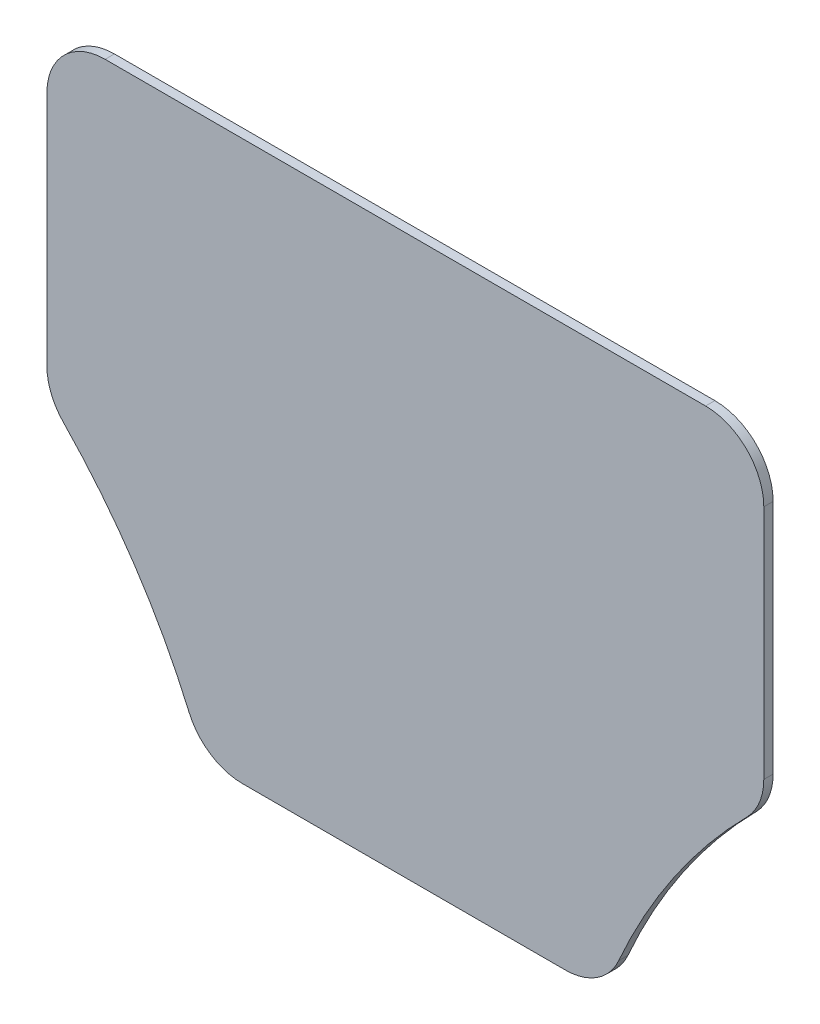
ISO-10303-21;
HEADER;
FILE_DESCRIPTION(('STEP AP214'),'2;1');
FILE_NAME('part.step','',(''),(''),'','','');
FILE_SCHEMA(('AUTOMOTIVE_DESIGN { 1 0 10303 214 1 1 1 1 }'));
ENDSEC;
DATA;
#1=APPLICATION_CONTEXT('core data for automotive mechanical design processes');
#2=APPLICATION_PROTOCOL_DEFINITION('international standard','automotive_design',2000,#1);
#3=PRODUCT_CONTEXT('',#1,'mechanical');
#4=PRODUCT('Part','Part','',(#3));
#5=PRODUCT_RELATED_PRODUCT_CATEGORY('part','',(#4));
#6=PRODUCT_DEFINITION_FORMATION('','',#4);
#7=PRODUCT_DEFINITION_CONTEXT('part definition',#1,'design');
#8=PRODUCT_DEFINITION('design','',#6,#7);
#9=PRODUCT_DEFINITION_SHAPE('','',#8);
#10=(LENGTH_UNIT() NAMED_UNIT(*) SI_UNIT(.MILLI.,.METRE.));
#11=(NAMED_UNIT(*) PLANE_ANGLE_UNIT() SI_UNIT($,.RADIAN.));
#12=(NAMED_UNIT(*) SI_UNIT($,.STERADIAN.) SOLID_ANGLE_UNIT());
#13=UNCERTAINTY_MEASURE_WITH_UNIT(LENGTH_MEASURE(1.E-05),#10,'distance_accuracy_value','');
#14=(GEOMETRIC_REPRESENTATION_CONTEXT(3) GLOBAL_UNCERTAINTY_ASSIGNED_CONTEXT((#13)) GLOBAL_UNIT_ASSIGNED_CONTEXT((#10,
#11,#12)) REPRESENTATION_CONTEXT('',''));
#15=CARTESIAN_POINT('',(0.,0.,0.));
#16=DIRECTION('',(0.,0.,1.));
#17=DIRECTION('',(1.,0.,0.));
#18=AXIS2_PLACEMENT_3D('',#15,#16,#17);
#19=CARTESIAN_POINT('',(-16.129,27.305,0.508));
#20=DIRECTION('',(0.,0.,-1.));
#21=DIRECTION('',(-1.,0.,0.));
#22=AXIS2_PLACEMENT_3D('',#19,#20,#21);
#23=PLANE('',#22);
#24=CARTESIAN_POINT('',(-16.129,14.4008161427791,0.508));
#25=DIRECTION('',(0.,0.,1.));
#26=DIRECTION('',(1.,0.,0.));
#27=AXIS2_PLACEMENT_3D('',#24,#25,#26);
#28=CIRCLE('',#27,3.175);
#29=CARTESIAN_POINT('',(-18.4085594978087,12.1907859402818,0.508));
#30=VERTEX_POINT('',#29);
#31=CARTESIAN_POINT('',(-19.304,14.4008161427791,0.508));
#32=VERTEX_POINT('',#31);
#33=EDGE_CURVE('E104',#30,#32,#28,.F.);
#34=ORIENTED_EDGE('',*,*,#33,.F.);
#35=CARTESIAN_POINT('',(-43.0278020741426,-11.6775402466888,0.508));
#36=DIRECTION('',(0.,0.,1.));
#37=DIRECTION('',(1.,0.,0.));
#38=AXIS2_PLACEMENT_3D('',#35,#36,#37);
#39=CIRCLE('',#38,34.29);
#40=CARTESIAN_POINT('',(-11.54746961988,1.91631014858569,0.508));
#41=VERTEX_POINT('',#40);
#42=EDGE_CURVE('E20',#30,#41,#39,.F.);
#43=ORIENTED_EDGE('',*,*,#42,.T.);
#44=CARTESIAN_POINT('',(-8.63262402226312,3.175,0.508));
#45=DIRECTION('',(0.,0.,1.));
#46=DIRECTION('',(1.,0.,0.));
#47=AXIS2_PLACEMENT_3D('',#44,#45,#46);
#48=CIRCLE('',#47,3.175);
#49=CARTESIAN_POINT('',(-8.63262402226312,0.,0.508));
#50=VERTEX_POINT('',#49);
#51=EDGE_CURVE('E130',#50,#41,#48,.F.);
#52=ORIENTED_EDGE('',*,*,#51,.F.);
#53=DIRECTION('',(1.,0.,0.));
#54=VECTOR('',#53,1.);
#55=CARTESIAN_POINT('',(11.1252,0.,0.508));
#56=LINE('',#55,#54);
#57=CARTESIAN_POINT('',(8.9875656354306,0.,0.508));
#58=VERTEX_POINT('',#57);
#59=EDGE_CURVE('E128',#58,#50,#56,.F.);
#60=ORIENTED_EDGE('',*,*,#59,.F.);
#61=CARTESIAN_POINT('',(8.9875656354306,3.175,0.508));
#62=DIRECTION('',(0.,0.,1.));
#63=DIRECTION('',(1.,0.,0.));
#64=AXIS2_PLACEMENT_3D('',#61,#62,#63);
#65=CIRCLE('',#64,3.175);
#66=CARTESIAN_POINT('',(11.8932658478202,1.89533939041682,0.508));
#67=VERTEX_POINT('',#66);
#68=EDGE_CURVE('E165',#67,#58,#65,.F.);
#69=ORIENTED_EDGE('',*,*,#68,.F.);
#70=CARTESIAN_POINT('',(43.2748281416284,-11.9249951930814,0.508));
#71=DIRECTION('',(0.,0.,1.));
#72=DIRECTION('',(1.,0.,0.));
#73=AXIS2_PLACEMENT_3D('',#70,#71,#72);
#74=CIRCLE('',#73,34.29);
#75=CARTESIAN_POINT('',(18.8944430628499,12.1872615119736,0.508));
#76=VERTEX_POINT('',#75);
#77=EDGE_CURVE('E168',#67,#76,#74,.F.);
#78=ORIENTED_EDGE('',*,*,#77,.T.);
#79=CARTESIAN_POINT('',(16.637,14.4198778735528,0.508));
#80=DIRECTION('',(0.,0.,1.));
#81=DIRECTION('',(1.,0.,0.));
#82=AXIS2_PLACEMENT_3D('',#79,#80,#81);
#83=CIRCLE('',#82,3.175);
#84=CARTESIAN_POINT('',(19.812,14.4198778735528,0.508));
#85=VERTEX_POINT('',#84);
#86=EDGE_CURVE('E172',#85,#76,#83,.F.);
#87=ORIENTED_EDGE('',*,*,#86,.F.);
#88=DIRECTION('',(0.,1.,0.));
#89=VECTOR('',#88,1.);
#90=CARTESIAN_POINT('',(19.812,27.305,0.508));
#91=LINE('',#90,#89);
#92=CARTESIAN_POINT('',(19.812,27.305,0.508));
#93=VERTEX_POINT('',#92);
#94=EDGE_CURVE('E132',#93,#85,#91,.F.);
#95=ORIENTED_EDGE('',*,*,#94,.F.);
#96=CARTESIAN_POINT('',(16.637,27.305,0.508));
#97=DIRECTION('',(0.,0.,1.));
#98=DIRECTION('',(1.,0.,0.));
#99=AXIS2_PLACEMENT_3D('',#96,#97,#98);
#100=CIRCLE('',#99,3.175);
#101=CARTESIAN_POINT('',(16.637,30.48,0.508));
#102=VERTEX_POINT('',#101);
#103=EDGE_CURVE('E136',#102,#93,#100,.F.);
#104=ORIENTED_EDGE('',*,*,#103,.F.);
#105=DIRECTION('',(-1.,0.,0.));
#106=VECTOR('',#105,1.);
#107=CARTESIAN_POINT('',(-16.129,30.48,0.508));
#108=LINE('',#107,#106);
#109=CARTESIAN_POINT('',(-16.129,30.48,0.508));
#110=VERTEX_POINT('',#109);
#111=EDGE_CURVE('E137',#110,#102,#108,.F.);
#112=ORIENTED_EDGE('',*,*,#111,.F.);
#113=CARTESIAN_POINT('',(-16.129,27.305,0.508));
#114=DIRECTION('',(0.,0.,1.));
#115=DIRECTION('',(1.,0.,0.));
#116=AXIS2_PLACEMENT_3D('',#113,#114,#115);
#117=CIRCLE('',#116,3.175);
#118=CARTESIAN_POINT('',(-19.304,27.305,0.508));
#119=VERTEX_POINT('',#118);
#120=EDGE_CURVE('E177',#119,#110,#117,.F.);
#121=ORIENTED_EDGE('',*,*,#120,.F.);
#122=DIRECTION('',(0.,-1.,0.));
#123=VECTOR('',#122,1.);
#124=CARTESIAN_POINT('',(-19.304,13.081,0.508));
#125=LINE('',#124,#123);
#126=EDGE_CURVE('E108',#32,#119,#125,.F.);
#127=ORIENTED_EDGE('',*,*,#126,.F.);
#128=EDGE_LOOP('',(#34,#43,#52,#60,#69,#78,#87,#95,#104,#112,#121,#127));
#129=FACE_BOUND('',#128,.T.);
#130=ADVANCED_FACE('F17',(#129),#23,.F.);
#131=CARTESIAN_POINT('',(-43.0278020741426,-11.6775402466888,0.508));
#132=DIRECTION('',(0.,0.,1.));
#133=DIRECTION('',(1.,0.,0.));
#134=AXIS2_PLACEMENT_3D('',#131,#132,#133);
#135=CYLINDRICAL_SURFACE('',#134,34.29);
#136=DIRECTION('',(0.,0.,1.));
#137=VECTOR('',#136,1.);
#138=CARTESIAN_POINT('',(-18.4085594978087,12.1907859402819,0.508));
#139=LINE('',#138,#137);
#140=CARTESIAN_POINT('',(-18.4085594978087,12.1907859402818,0.));
#141=VERTEX_POINT('',#140);
#142=EDGE_CURVE('E112',#141,#30,#139,.T.);
#143=ORIENTED_EDGE('',*,*,#142,.F.);
#144=CARTESIAN_POINT('',(-43.0278020741426,-11.6775402466888,0.));
#145=DIRECTION('',(0.,0.,1.));
#146=DIRECTION('',(1.,0.,0.));
#147=AXIS2_PLACEMENT_3D('',#144,#145,#146);
#148=CIRCLE('',#147,34.29);
#149=CARTESIAN_POINT('',(-11.54746961988,1.91631014858569,0.));
#150=VERTEX_POINT('',#149);
#151=EDGE_CURVE('E162',#150,#141,#148,.T.);
#152=ORIENTED_EDGE('',*,*,#151,.F.);
#153=DIRECTION('',(0.,0.,1.));
#154=VECTOR('',#153,1.);
#155=CARTESIAN_POINT('',(-11.54746961988,1.91631014858569,0.508));
#156=LINE('',#155,#154);
#157=EDGE_CURVE('E117',#41,#150,#156,.F.);
#158=ORIENTED_EDGE('',*,*,#157,.F.);
#159=ORIENTED_EDGE('',*,*,#42,.F.);
#160=EDGE_LOOP('',(#143,#152,#158,#159));
#161=FACE_BOUND('',#160,.T.);
#162=ADVANCED_FACE('F114',(#161),#135,.F.);
#163=CARTESIAN_POINT('',(-16.129,14.4008161427791,0.508));
#164=DIRECTION('',(0.,0.,1.));
#165=DIRECTION('',(1.,0.,0.));
#166=AXIS2_PLACEMENT_3D('',#163,#164,#165);
#167=CYLINDRICAL_SURFACE('',#166,3.175);
#168=CARTESIAN_POINT('',(-16.129,14.4008161427791,0.));
#169=DIRECTION('',(0.,0.,1.));
#170=DIRECTION('',(1.,0.,0.));
#171=AXIS2_PLACEMENT_3D('',#168,#169,#170);
#172=CIRCLE('',#171,3.175);
#173=CARTESIAN_POINT('',(-19.304,14.4008161427791,0.));
#174=VERTEX_POINT('',#173);
#175=EDGE_CURVE('E121',#141,#174,#172,.F.);
#176=ORIENTED_EDGE('',*,*,#175,.F.);
#177=ORIENTED_EDGE('',*,*,#142,.T.);
#178=ORIENTED_EDGE('',*,*,#33,.T.);
#179=DIRECTION('',(0.,0.,1.));
#180=VECTOR('',#179,1.);
#181=CARTESIAN_POINT('',(-19.304,14.4008161427791,0.508));
#182=LINE('',#181,#180);
#183=EDGE_CURVE('E123',#174,#32,#182,.T.);
#184=ORIENTED_EDGE('',*,*,#183,.F.);
#185=EDGE_LOOP('',(#176,#177,#178,#184));
#186=FACE_BOUND('',#185,.T.);
#187=ADVANCED_FACE('F119',(#186),#167,.T.);
#188=CARTESIAN_POINT('',(-19.304,13.081,0.508));
#189=DIRECTION('',(-1.,0.,0.));
#190=DIRECTION('',(0.,-1.,0.));
#191=AXIS2_PLACEMENT_3D('',#188,#189,#190);
#192=PLANE('',#191);
#193=ORIENTED_EDGE('',*,*,#126,.T.);
#194=DIRECTION('',(0.,0.,1.));
#195=VECTOR('',#194,1.);
#196=CARTESIAN_POINT('',(-19.304,27.305,0.508));
#197=LINE('',#196,#195);
#198=CARTESIAN_POINT('',(-19.304,27.305,0.));
#199=VERTEX_POINT('',#198);
#200=EDGE_CURVE('E141',#199,#119,#197,.T.);
#201=ORIENTED_EDGE('',*,*,#200,.F.);
#202=DIRECTION('',(0.,1.,0.));
#203=VECTOR('',#202,1.);
#204=CARTESIAN_POINT('',(-19.304,27.305,0.));
#205=LINE('',#204,#203);
#206=EDGE_CURVE('E160',#174,#199,#205,.T.);
#207=ORIENTED_EDGE('',*,*,#206,.F.);
#208=ORIENTED_EDGE('',*,*,#183,.T.);
#209=EDGE_LOOP('',(#193,#201,#207,#208));
#210=FACE_BOUND('',#209,.T.);
#211=ADVANCED_FACE('F250',(#210),#192,.T.);
#212=CARTESIAN_POINT('',(-16.129,27.305,0.508));
#213=DIRECTION('',(0.,0.,1.));
#214=DIRECTION('',(1.,0.,0.));
#215=AXIS2_PLACEMENT_3D('',#212,#213,#214);
#216=CYLINDRICAL_SURFACE('',#215,3.175);
#217=ORIENTED_EDGE('',*,*,#120,.T.);
#218=DIRECTION('',(0.,0.,1.));
#219=VECTOR('',#218,1.);
#220=CARTESIAN_POINT('',(-16.129,30.48,0.508));
#221=LINE('',#220,#219);
#222=CARTESIAN_POINT('',(-16.129,30.48,0.));
#223=VERTEX_POINT('',#222);
#224=EDGE_CURVE('E140',#223,#110,#221,.T.);
#225=ORIENTED_EDGE('',*,*,#224,.F.);
#226=CARTESIAN_POINT('',(-16.129,27.305,0.));
#227=DIRECTION('',(0.,0.,1.));
#228=DIRECTION('',(1.,0.,0.));
#229=AXIS2_PLACEMENT_3D('',#226,#227,#228);
#230=CIRCLE('',#229,3.175);
#231=EDGE_CURVE('E157',#199,#223,#230,.F.);
#232=ORIENTED_EDGE('',*,*,#231,.F.);
#233=ORIENTED_EDGE('',*,*,#200,.T.);
#234=EDGE_LOOP('',(#217,#225,#232,#233));
#235=FACE_BOUND('',#234,.T.);
#236=ADVANCED_FACE('F246',(#235),#216,.T.);
#237=CARTESIAN_POINT('',(-16.129,30.48,0.508));
#238=DIRECTION('',(0.,1.,0.));
#239=DIRECTION('',(-1.,0.,0.));
#240=AXIS2_PLACEMENT_3D('',#237,#238,#239);
#241=PLANE('',#240);
#242=ORIENTED_EDGE('',*,*,#111,.T.);
#243=DIRECTION('',(0.,0.,1.));
#244=VECTOR('',#243,1.);
#245=CARTESIAN_POINT('',(16.637,30.48,0.508));
#246=LINE('',#245,#244);
#247=CARTESIAN_POINT('',(16.637,30.48,0.));
#248=VERTEX_POINT('',#247);
#249=EDGE_CURVE('E139',#248,#102,#246,.T.);
#250=ORIENTED_EDGE('',*,*,#249,.F.);
#251=DIRECTION('',(-1.,0.,0.));
#252=VECTOR('',#251,1.);
#253=CARTESIAN_POINT('',(-16.129,30.48,0.));
#254=LINE('',#253,#252);
#255=EDGE_CURVE('E156',#223,#248,#254,.F.);
#256=ORIENTED_EDGE('',*,*,#255,.F.);
#257=ORIENTED_EDGE('',*,*,#224,.T.);
#258=EDGE_LOOP('',(#242,#250,#256,#257));
#259=FACE_BOUND('',#258,.T.);
#260=ADVANCED_FACE('F242',(#259),#241,.T.);
#261=CARTESIAN_POINT('',(16.637,27.305,0.508));
#262=DIRECTION('',(0.,0.,1.));
#263=DIRECTION('',(1.,0.,0.));
#264=AXIS2_PLACEMENT_3D('',#261,#262,#263);
#265=CYLINDRICAL_SURFACE('',#264,3.175);
#266=ORIENTED_EDGE('',*,*,#103,.T.);
#267=DIRECTION('',(0.,0.,-1.));
#268=VECTOR('',#267,1.);
#269=CARTESIAN_POINT('',(19.812,27.305,0.508));
#270=LINE('',#269,#268);
#271=CARTESIAN_POINT('',(19.812,27.305,0.));
#272=VERTEX_POINT('',#271);
#273=EDGE_CURVE('E135',#272,#93,#270,.F.);
#274=ORIENTED_EDGE('',*,*,#273,.F.);
#275=CARTESIAN_POINT('',(16.637,27.305,0.));
#276=DIRECTION('',(0.,0.,1.));
#277=DIRECTION('',(1.,0.,0.));
#278=AXIS2_PLACEMENT_3D('',#275,#276,#277);
#279=CIRCLE('',#278,3.175);
#280=EDGE_CURVE('E153',#248,#272,#279,.F.);
#281=ORIENTED_EDGE('',*,*,#280,.F.);
#282=ORIENTED_EDGE('',*,*,#249,.T.);
#283=EDGE_LOOP('',(#266,#274,#281,#282));
#284=FACE_BOUND('',#283,.T.);
#285=ADVANCED_FACE('F238',(#284),#265,.T.);
#286=CARTESIAN_POINT('',(19.812,27.305,0.508));
#287=DIRECTION('',(1.,0.,0.));
#288=DIRECTION('',(0.,0.,-1.));
#289=AXIS2_PLACEMENT_3D('',#286,#287,#288);
#290=PLANE('',#289);
#291=DIRECTION('',(0.,1.,0.));
#292=VECTOR('',#291,1.);
#293=CARTESIAN_POINT('',(19.812,27.305,0.));
#294=LINE('',#293,#292);
#295=CARTESIAN_POINT('',(19.812,14.4198778735528,0.));
#296=VERTEX_POINT('',#295);
#297=EDGE_CURVE('E152',#272,#296,#294,.F.);
#298=ORIENTED_EDGE('',*,*,#297,.F.);
#299=ORIENTED_EDGE('',*,*,#273,.T.);
#300=ORIENTED_EDGE('',*,*,#94,.T.);
#301=DIRECTION('',(0.,0.,1.));
#302=VECTOR('',#301,1.);
#303=CARTESIAN_POINT('',(19.812,14.4198778735528,0.508));
#304=LINE('',#303,#302);
#305=EDGE_CURVE('E174',#296,#85,#304,.T.);
#306=ORIENTED_EDGE('',*,*,#305,.F.);
#307=EDGE_LOOP('',(#298,#299,#300,#306));
#308=FACE_BOUND('',#307,.T.);
#309=ADVANCED_FACE('F234',(#308),#290,.T.);
#310=CARTESIAN_POINT('',(16.637,14.4198778735528,0.508));
#311=DIRECTION('',(0.,0.,1.));
#312=DIRECTION('',(1.,0.,0.));
#313=AXIS2_PLACEMENT_3D('',#310,#311,#312);
#314=CYLINDRICAL_SURFACE('',#313,3.175);
#315=CARTESIAN_POINT('',(16.637,14.4198778735528,0.));
#316=DIRECTION('',(0.,0.,1.));
#317=DIRECTION('',(1.,0.,0.));
#318=AXIS2_PLACEMENT_3D('',#315,#316,#317);
#319=CIRCLE('',#318,3.175);
#320=CARTESIAN_POINT('',(18.8944430628498,12.1872615119737,0.));
#321=VERTEX_POINT('',#320);
#322=EDGE_CURVE('E149',#296,#321,#319,.F.);
#323=ORIENTED_EDGE('',*,*,#322,.F.);
#324=ORIENTED_EDGE('',*,*,#305,.T.);
#325=ORIENTED_EDGE('',*,*,#86,.T.);
#326=DIRECTION('',(0.,0.,1.));
#327=VECTOR('',#326,1.);
#328=CARTESIAN_POINT('',(18.8944430628499,12.1872615119737,0.508));
#329=LINE('',#328,#327);
#330=EDGE_CURVE('E171',#76,#321,#329,.F.);
#331=ORIENTED_EDGE('',*,*,#330,.T.);
#332=EDGE_LOOP('',(#323,#324,#325,#331));
#333=FACE_BOUND('',#332,.T.);
#334=ADVANCED_FACE('F230',(#333),#314,.T.);
#335=CARTESIAN_POINT('',(43.2748281416284,-11.9249951930814,0.508));
#336=DIRECTION('',(0.,0.,1.));
#337=DIRECTION('',(1.,0.,0.));
#338=AXIS2_PLACEMENT_3D('',#335,#336,#337);
#339=CYLINDRICAL_SURFACE('',#338,34.29);
#340=DIRECTION('',(0.,0.,1.));
#341=VECTOR('',#340,1.);
#342=CARTESIAN_POINT('',(11.8932658478202,1.89533939041681,0.508));
#343=LINE('',#342,#341);
#344=CARTESIAN_POINT('',(11.8932658478202,1.89533939041682,0.));
#345=VERTEX_POINT('',#344);
#346=EDGE_CURVE('E167',#345,#67,#343,.T.);
#347=ORIENTED_EDGE('',*,*,#346,.F.);
#348=CARTESIAN_POINT('',(43.2748281416284,-11.9249951930814,0.));
#349=DIRECTION('',(0.,0.,1.));
#350=DIRECTION('',(1.,0.,0.));
#351=AXIS2_PLACEMENT_3D('',#348,#349,#350);
#352=CIRCLE('',#351,34.29);
#353=EDGE_CURVE('E146',#321,#345,#352,.T.);
#354=ORIENTED_EDGE('',*,*,#353,.F.);
#355=ORIENTED_EDGE('',*,*,#330,.F.);
#356=ORIENTED_EDGE('',*,*,#77,.F.);
#357=EDGE_LOOP('',(#347,#354,#355,#356));
#358=FACE_BOUND('',#357,.T.);
#359=ADVANCED_FACE('F227',(#358),#339,.F.);
#360=CARTESIAN_POINT('',(8.9875656354306,3.175,0.508));
#361=DIRECTION('',(0.,0.,1.));
#362=DIRECTION('',(1.,0.,0.));
#363=AXIS2_PLACEMENT_3D('',#360,#361,#362);
#364=CYLINDRICAL_SURFACE('',#363,3.175);
#365=CARTESIAN_POINT('',(8.9875656354306,3.175,0.));
#366=DIRECTION('',(0.,0.,1.));
#367=DIRECTION('',(1.,0.,0.));
#368=AXIS2_PLACEMENT_3D('',#365,#366,#367);
#369=CIRCLE('',#368,3.175);
#370=CARTESIAN_POINT('',(8.9875656354306,0.,0.));
#371=VERTEX_POINT('',#370);
#372=EDGE_CURVE('E143',#345,#371,#369,.F.);
#373=ORIENTED_EDGE('',*,*,#372,.F.);
#374=ORIENTED_EDGE('',*,*,#346,.T.);
#375=ORIENTED_EDGE('',*,*,#68,.T.);
#376=DIRECTION('',(0.,0.,1.));
#377=VECTOR('',#376,1.);
#378=CARTESIAN_POINT('',(8.9875656354306,0.,0.508));
#379=LINE('',#378,#377);
#380=EDGE_CURVE('E131',#371,#58,#379,.T.);
#381=ORIENTED_EDGE('',*,*,#380,.F.);
#382=EDGE_LOOP('',(#373,#374,#375,#381));
#383=FACE_BOUND('',#382,.T.);
#384=ADVANCED_FACE('F211',(#383),#364,.T.);
#385=CARTESIAN_POINT('',(11.1252,0.,0.508));
#386=DIRECTION('',(0.,-1.,0.));
#387=DIRECTION('',(1.,0.,0.));
#388=AXIS2_PLACEMENT_3D('',#385,#386,#387);
#389=PLANE('',#388);
#390=ORIENTED_EDGE('',*,*,#59,.T.);
#391=DIRECTION('',(0.,0.,1.));
#392=VECTOR('',#391,1.);
#393=CARTESIAN_POINT('',(-8.63262402226312,0.,0.508));
#394=LINE('',#393,#392);
#395=CARTESIAN_POINT('',(-8.63262402226312,0.,0.));
#396=VERTEX_POINT('',#395);
#397=EDGE_CURVE('E35',#396,#50,#394,.T.);
#398=ORIENTED_EDGE('',*,*,#397,.F.);
#399=DIRECTION('',(-1.,0.,0.));
#400=VECTOR('',#399,1.);
#401=CARTESIAN_POINT('',(-16.129,0.,0.));
#402=LINE('',#401,#400);
#403=EDGE_CURVE('E26',#371,#396,#402,.T.);
#404=ORIENTED_EDGE('',*,*,#403,.F.);
#405=ORIENTED_EDGE('',*,*,#380,.T.);
#406=EDGE_LOOP('',(#390,#398,#404,#405));
#407=FACE_BOUND('',#406,.T.);
#408=ADVANCED_FACE('F208',(#407),#389,.T.);
#409=CARTESIAN_POINT('',(-8.63262402226312,3.175,0.508));
#410=DIRECTION('',(0.,0.,1.));
#411=DIRECTION('',(1.,0.,0.));
#412=AXIS2_PLACEMENT_3D('',#409,#410,#411);
#413=CYLINDRICAL_SURFACE('',#412,3.175);
#414=CARTESIAN_POINT('',(-8.63262402226312,3.175,0.));
#415=DIRECTION('',(0.,0.,1.));
#416=DIRECTION('',(1.,0.,0.));
#417=AXIS2_PLACEMENT_3D('',#414,#415,#416);
#418=CIRCLE('',#417,3.175);
#419=EDGE_CURVE('E11',#396,#150,#418,.F.);
#420=ORIENTED_EDGE('',*,*,#419,.F.);
#421=ORIENTED_EDGE('',*,*,#397,.T.);
#422=ORIENTED_EDGE('',*,*,#51,.T.);
#423=ORIENTED_EDGE('',*,*,#157,.T.);
#424=EDGE_LOOP('',(#420,#421,#422,#423));
#425=FACE_BOUND('',#424,.T.);
#426=ADVANCED_FACE('F214',(#425),#413,.T.);
#427=CARTESIAN_POINT('',(-16.129,27.305,0.));
#428=DIRECTION('',(0.,0.,-1.));
#429=DIRECTION('',(-1.,0.,0.));
#430=AXIS2_PLACEMENT_3D('',#427,#428,#429);
#431=PLANE('',#430);
#432=ORIENTED_EDGE('',*,*,#403,.T.);
#433=ORIENTED_EDGE('',*,*,#419,.T.);
#434=ORIENTED_EDGE('',*,*,#151,.T.);
#435=ORIENTED_EDGE('',*,*,#175,.T.);
#436=ORIENTED_EDGE('',*,*,#206,.T.);
#437=ORIENTED_EDGE('',*,*,#231,.T.);
#438=ORIENTED_EDGE('',*,*,#255,.T.);
#439=ORIENTED_EDGE('',*,*,#280,.T.);
#440=ORIENTED_EDGE('',*,*,#297,.T.);
#441=ORIENTED_EDGE('',*,*,#322,.T.);
#442=ORIENTED_EDGE('',*,*,#353,.T.);
#443=ORIENTED_EDGE('',*,*,#372,.T.);
#444=EDGE_LOOP('',(#432,#433,#434,#435,#436,#437,#438,#439,#440,#441,#442,#443));
#445=FACE_BOUND('',#444,.T.);
#446=ADVANCED_FACE('F206',(#445),#431,.T.);
#447=CLOSED_SHELL('',(#130,#162,#187,#211,#236,#260,#285,#309,#334,#359,#384,#408,#426,#446));
#448=MANIFOLD_SOLID_BREP('B1',#447);
#449=ADVANCED_BREP_SHAPE_REPRESENTATION('',(#18,#448),#14);
#450=SHAPE_DEFINITION_REPRESENTATION(#9,#449);
ENDSEC;
END-ISO-10303-21;
